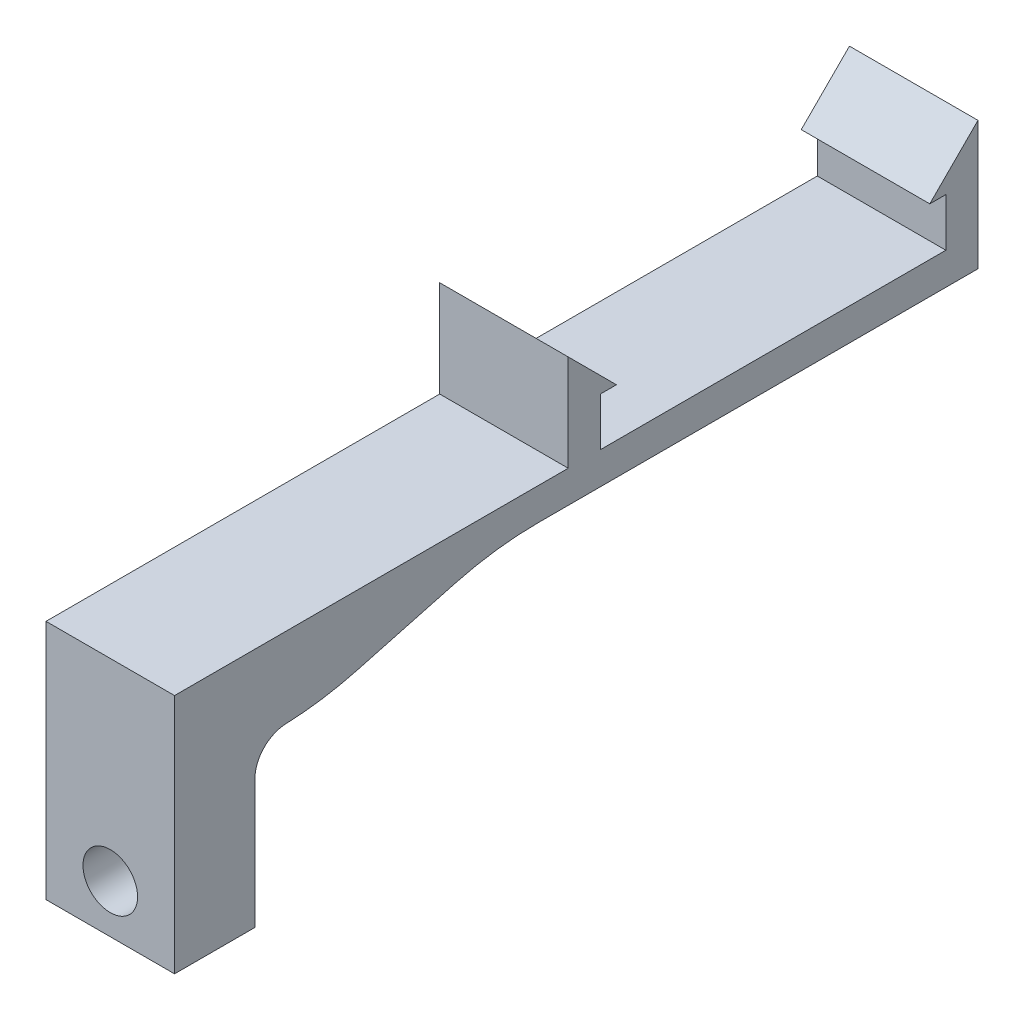
ISO-10303-21;
HEADER;
FILE_DESCRIPTION(('STEP AP214'),'2;1');
FILE_NAME('part.step','',(''),(''),'','','');
FILE_SCHEMA(('AUTOMOTIVE_DESIGN { 1 0 10303 214 1 1 1 1 }'));
ENDSEC;
DATA;
#1=APPLICATION_CONTEXT('core data for automotive mechanical design processes');
#2=APPLICATION_PROTOCOL_DEFINITION('international standard','automotive_design',2000,#1);
#3=PRODUCT_CONTEXT('',#1,'mechanical');
#4=PRODUCT('Part','Part','',(#3));
#5=PRODUCT_RELATED_PRODUCT_CATEGORY('part','',(#4));
#6=PRODUCT_DEFINITION_FORMATION('','',#4);
#7=PRODUCT_DEFINITION_CONTEXT('part definition',#1,'design');
#8=PRODUCT_DEFINITION('design','',#6,#7);
#9=PRODUCT_DEFINITION_SHAPE('','',#8);
#10=(LENGTH_UNIT() NAMED_UNIT(*) SI_UNIT(.MILLI.,.METRE.));
#11=(NAMED_UNIT(*) PLANE_ANGLE_UNIT() SI_UNIT($,.RADIAN.));
#12=(NAMED_UNIT(*) SI_UNIT($,.STERADIAN.) SOLID_ANGLE_UNIT());
#13=UNCERTAINTY_MEASURE_WITH_UNIT(LENGTH_MEASURE(1.E-05),#10,'distance_accuracy_value','');
#14=(GEOMETRIC_REPRESENTATION_CONTEXT(3) GLOBAL_UNCERTAINTY_ASSIGNED_CONTEXT((#13)) GLOBAL_UNIT_ASSIGNED_CONTEXT((#10,
#11,#12)) REPRESENTATION_CONTEXT('',''));
#15=CARTESIAN_POINT('',(0.,0.,0.));
#16=DIRECTION('',(0.,0.,1.));
#17=DIRECTION('',(1.,0.,0.));
#18=AXIS2_PLACEMENT_3D('',#15,#16,#17);
#19=CARTESIAN_POINT('',(-4.,7.5,5.));
#20=DIRECTION('',(0.,-1.,0.));
#21=DIRECTION('',(0.,0.,-1.));
#22=AXIS2_PLACEMENT_3D('',#19,#20,#21);
#23=PLANE('',#22);
#24=DIRECTION('',(0.,0.,-1.));
#25=VECTOR('',#24,1.);
#26=CARTESIAN_POINT('',(4.,7.5,5.));
#27=LINE('',#26,#25);
#28=CARTESIAN_POINT('',(4.,7.5,-21.5));
#29=VERTEX_POINT('',#28);
#30=CARTESIAN_POINT('',(4.,7.5,-43.));
#31=VERTEX_POINT('',#30);
#32=EDGE_CURVE('E224',#29,#31,#27,.T.);
#33=ORIENTED_EDGE('',*,*,#32,.T.);
#34=DIRECTION('',(-1.,0.,0.));
#35=VECTOR('',#34,1.);
#36=CARTESIAN_POINT('',(10.7082039324994,7.5,-43.));
#37=LINE('',#36,#35);
#38=CARTESIAN_POINT('',(-4.,7.5,-43.));
#39=VERTEX_POINT('',#38);
#40=EDGE_CURVE('E278',#31,#39,#37,.T.);
#41=ORIENTED_EDGE('',*,*,#40,.T.);
#42=DIRECTION('',(0.,0.,-1.));
#43=VECTOR('',#42,1.);
#44=CARTESIAN_POINT('',(-4.,7.5,5.));
#45=LINE('',#44,#43);
#46=CARTESIAN_POINT('',(-4.,7.5,-21.5));
#47=VERTEX_POINT('',#46);
#48=EDGE_CURVE('E220',#47,#39,#45,.T.);
#49=ORIENTED_EDGE('',*,*,#48,.F.);
#50=DIRECTION('',(-1.,0.,0.));
#51=VECTOR('',#50,1.);
#52=CARTESIAN_POINT('',(10.7082039324994,7.5,-21.5));
#53=LINE('',#52,#51);
#54=EDGE_CURVE('E293',#29,#47,#53,.T.);
#55=ORIENTED_EDGE('',*,*,#54,.F.);
#56=EDGE_LOOP('',(#33,#41,#49,#55));
#57=FACE_BOUND('',#56,.T.);
#58=ADVANCED_FACE('F39',(#57),#23,.F.);
#59=CARTESIAN_POINT('',(0.,0.,0.));
#60=DIRECTION('',(0.,0.,1.));
#61=DIRECTION('',(1.,0.,0.));
#62=AXIS2_PLACEMENT_3D('',#59,#60,#61);
#63=PLANE('',#62);
#64=CARTESIAN_POINT('',(0.,-4.5,0.));
#65=DIRECTION('',(0.,0.,1.));
#66=DIRECTION('',(1.,0.,0.));
#67=AXIS2_PLACEMENT_3D('',#64,#65,#66);
#68=CIRCLE('',#67,1.69999999999999);
#69=CARTESIAN_POINT('',(1.69999999999999,-4.5,0.));
#70=VERTEX_POINT('',#69);
#71=EDGE_CURVE('E257',#70,#70,#68,.T.);
#72=ORIENTED_EDGE('',*,*,#71,.T.);
#73=EDGE_LOOP('',(#72));
#74=FACE_BOUND('',#73,.T.);
#75=DIRECTION('',(0.,-1.,0.));
#76=VECTOR('',#75,1.);
#77=CARTESIAN_POINT('',(-4.,7.5,0.));
#78=LINE('',#77,#76);
#79=CARTESIAN_POINT('',(-4.,0.515632294236922,0.));
#80=VERTEX_POINT('',#79);
#81=CARTESIAN_POINT('',(-4.,-7.5,0.));
#82=VERTEX_POINT('',#81);
#83=EDGE_CURVE('E212',#80,#82,#78,.T.);
#84=ORIENTED_EDGE('',*,*,#83,.F.);
#85=DIRECTION('',(-1.,0.,0.));
#86=VECTOR('',#85,1.);
#87=CARTESIAN_POINT('',(0.,0.515632294236922,0.));
#88=LINE('',#87,#86);
#89=CARTESIAN_POINT('',(4.,0.515632294236922,0.));
#90=VERTEX_POINT('',#89);
#91=EDGE_CURVE('E60',#80,#90,#88,.F.);
#92=ORIENTED_EDGE('',*,*,#91,.T.);
#93=DIRECTION('',(0.,1.,0.));
#94=VECTOR('',#93,1.);
#95=CARTESIAN_POINT('',(4.,7.5,0.));
#96=LINE('',#95,#94);
#97=CARTESIAN_POINT('',(4.,-7.5,0.));
#98=VERTEX_POINT('',#97);
#99=EDGE_CURVE('E192',#98,#90,#96,.T.);
#100=ORIENTED_EDGE('',*,*,#99,.F.);
#101=DIRECTION('',(1.,0.,0.));
#102=VECTOR('',#101,1.);
#103=CARTESIAN_POINT('',(-4.,-7.5,0.));
#104=LINE('',#103,#102);
#105=EDGE_CURVE('E204',#82,#98,#104,.T.);
#106=ORIENTED_EDGE('',*,*,#105,.F.);
#107=EDGE_LOOP('',(#84,#92,#100,#106));
#108=FACE_BOUND('',#107,.T.);
#109=ADVANCED_FACE('F347',(#74,#108),#63,.F.);
#110=CARTESIAN_POINT('',(4.,7.5,5.));
#111=DIRECTION('',(-1.,0.,0.));
#112=DIRECTION('',(0.,-1.,0.));
#113=AXIS2_PLACEMENT_3D('',#110,#111,#112);
#114=PLANE('',#113);
#115=ORIENTED_EDGE('',*,*,#99,.T.);
#116=CARTESIAN_POINT('',(4.,0.515632294236922,-2.));
#117=DIRECTION('',(-1.,0.,0.));
#118=DIRECTION('',(0.,-1.,0.));
#119=AXIS2_PLACEMENT_3D('',#116,#117,#118);
#120=CIRCLE('',#119,2.);
#121=CARTESIAN_POINT('',(4.,2.51421117657902,-1.92461796595866));
#122=VERTEX_POINT('',#121);
#123=EDGE_CURVE('E11',#90,#122,#120,.T.);
#124=ORIENTED_EDGE('',*,*,#123,.T.);
#125=CARTESIAN_POINT('',(4.,22.5,-1.1707976255452));
#126=DIRECTION('',(-1.,0.,0.));
#127=DIRECTION('',(0.,-1.,0.));
#128=AXIS2_PLACEMENT_3D('',#125,#126,#127);
#129=CIRCLE('',#128,20.);
#130=CARTESIAN_POINT('',(4.,3.1814834742186,-6.34717852759549));
#131=VERTEX_POINT('',#130);
#132=EDGE_CURVE('E234',#122,#131,#129,.F.);
#133=ORIENTED_EDGE('',*,*,#132,.T.);
#134=DIRECTION('',(0.,0.258819045102514,-0.96592582628907));
#135=VECTOR('',#134,1.);
#136=CARTESIAN_POINT('',(4.,5.5,-15.));
#137=LINE('',#136,#135);
#138=CARTESIAN_POINT('',(4.,4.8185165257814,-12.4566690496976));
#139=VERTEX_POINT('',#138);
#140=EDGE_CURVE('E175',#131,#139,#137,.T.);
#141=ORIENTED_EDGE('',*,*,#140,.T.);
#142=CARTESIAN_POINT('',(4.,-14.5,-17.6330499517478));
#143=DIRECTION('',(-1.,0.,0.));
#144=DIRECTION('',(0.,-1.,0.));
#145=AXIS2_PLACEMENT_3D('',#142,#143,#144);
#146=CIRCLE('',#145,20.);
#147=CARTESIAN_POINT('',(4.,5.5,-17.6330499517478));
#148=VERTEX_POINT('',#147);
#149=EDGE_CURVE('E170',#139,#148,#146,.T.);
#150=ORIENTED_EDGE('',*,*,#149,.T.);
#151=DIRECTION('',(0.,0.,-1.));
#152=VECTOR('',#151,1.);
#153=CARTESIAN_POINT('',(4.,5.5,-45.));
#154=LINE('',#153,#152);
#155=CARTESIAN_POINT('',(4.,5.5,-45.));
#156=VERTEX_POINT('',#155);
#157=EDGE_CURVE('E162',#148,#156,#154,.T.);
#158=ORIENTED_EDGE('',*,*,#157,.T.);
#159=DIRECTION('',(0.,-1.,0.));
#160=VECTOR('',#159,1.);
#161=CARTESIAN_POINT('',(4.,7.5,-45.));
#162=LINE('',#161,#160);
#163=CARTESIAN_POINT('',(4.,13.5,-45.));
#164=VERTEX_POINT('',#163);
#165=EDGE_CURVE('E166',#164,#156,#162,.T.);
#166=ORIENTED_EDGE('',*,*,#165,.F.);
#167=DIRECTION('',(0.,-0.707106781186551,0.707106781186544));
#168=VECTOR('',#167,1.);
#169=CARTESIAN_POINT('',(4.,13.5,-45.));
#170=LINE('',#169,#168);
#171=CARTESIAN_POINT('',(4.,10.5,-42.));
#172=VERTEX_POINT('',#171);
#173=EDGE_CURVE('E194',#164,#172,#170,.T.);
#174=ORIENTED_EDGE('',*,*,#173,.T.);
#175=DIRECTION('',(0.,0.,-1.));
#176=VECTOR('',#175,1.);
#177=CARTESIAN_POINT('',(4.,10.5,-42.));
#178=LINE('',#177,#176);
#179=CARTESIAN_POINT('',(4.,10.5,-43.));
#180=VERTEX_POINT('',#179);
#181=EDGE_CURVE('E265',#172,#180,#178,.T.);
#182=ORIENTED_EDGE('',*,*,#181,.T.);
#183=DIRECTION('',(0.,-1.,0.));
#184=VECTOR('',#183,1.);
#185=CARTESIAN_POINT('',(4.,10.5,-43.));
#186=LINE('',#185,#184);
#187=EDGE_CURVE('E190',#180,#31,#186,.T.);
#188=ORIENTED_EDGE('',*,*,#187,.T.);
#189=ORIENTED_EDGE('',*,*,#32,.F.);
#190=DIRECTION('',(0.,1.,0.));
#191=VECTOR('',#190,1.);
#192=CARTESIAN_POINT('',(4.,7.5,-21.5));
#193=LINE('',#192,#191);
#194=CARTESIAN_POINT('',(4.,10.5,-21.5));
#195=VERTEX_POINT('',#194);
#196=EDGE_CURVE('E197',#29,#195,#193,.T.);
#197=ORIENTED_EDGE('',*,*,#196,.T.);
#198=DIRECTION('',(0.,0.,-1.));
#199=VECTOR('',#198,1.);
#200=CARTESIAN_POINT('',(4.,10.5,-21.5));
#201=LINE('',#200,#199);
#202=CARTESIAN_POINT('',(4.,10.5,-22.5));
#203=VERTEX_POINT('',#202);
#204=EDGE_CURVE('E183',#195,#203,#201,.T.);
#205=ORIENTED_EDGE('',*,*,#204,.T.);
#206=DIRECTION('',(0.,0.707106781186551,0.707106781186544));
#207=VECTOR('',#206,1.);
#208=CARTESIAN_POINT('',(4.,10.5,-22.5));
#209=LINE('',#208,#207);
#210=CARTESIAN_POINT('',(4.,13.5,-19.5));
#211=VERTEX_POINT('',#210);
#212=EDGE_CURVE('E287',#203,#211,#209,.T.);
#213=ORIENTED_EDGE('',*,*,#212,.T.);
#214=DIRECTION('',(0.,-1.,0.));
#215=VECTOR('',#214,1.);
#216=CARTESIAN_POINT('',(4.,13.5,-19.5));
#217=LINE('',#216,#215);
#218=CARTESIAN_POINT('',(4.,7.5,-19.5));
#219=VERTEX_POINT('',#218);
#220=EDGE_CURVE('E310',#211,#219,#217,.T.);
#221=ORIENTED_EDGE('',*,*,#220,.T.);
#222=CARTESIAN_POINT('',(4.,7.5,5.));
#223=VERTEX_POINT('',#222);
#224=EDGE_CURVE('E225',#223,#219,#27,.T.);
#225=ORIENTED_EDGE('',*,*,#224,.F.);
#226=DIRECTION('',(0.,1.,0.));
#227=VECTOR('',#226,1.);
#228=CARTESIAN_POINT('',(4.,7.5,5.));
#229=LINE('',#228,#227);
#230=CARTESIAN_POINT('',(4.,-7.5,5.));
#231=VERTEX_POINT('',#230);
#232=EDGE_CURVE('E200',#231,#223,#229,.T.);
#233=ORIENTED_EDGE('',*,*,#232,.F.);
#234=DIRECTION('',(0.,0.,-1.));
#235=VECTOR('',#234,1.);
#236=CARTESIAN_POINT('',(4.,-7.5,5.));
#237=LINE('',#236,#235);
#238=EDGE_CURVE('E210',#231,#98,#237,.T.);
#239=ORIENTED_EDGE('',*,*,#238,.T.);
#240=EDGE_LOOP('',(#115,#124,#133,#141,#150,#158,#166,#174,#182,#188,#189,#197,#205,#213,#221,
#225,#233,#239));
#241=FACE_BOUND('',#240,.T.);
#242=ADVANCED_FACE('F164',(#241),#114,.F.);
#243=ORIENTED_EDGE('',*,*,#224,.T.);
#244=DIRECTION('',(-1.,0.,0.));
#245=VECTOR('',#244,1.);
#246=CARTESIAN_POINT('',(10.7082039324994,7.5,-19.5));
#247=LINE('',#246,#245);
#248=CARTESIAN_POINT('',(-4.,7.5,-19.5));
#249=VERTEX_POINT('',#248);
#250=EDGE_CURVE('E296',#219,#249,#247,.T.);
#251=ORIENTED_EDGE('',*,*,#250,.T.);
#252=CARTESIAN_POINT('',(-4.,7.5,5.));
#253=VERTEX_POINT('',#252);
#254=EDGE_CURVE('E221',#253,#249,#45,.T.);
#255=ORIENTED_EDGE('',*,*,#254,.F.);
#256=DIRECTION('',(-1.,0.,0.));
#257=VECTOR('',#256,1.);
#258=CARTESIAN_POINT('',(-4.,7.5,5.));
#259=LINE('',#258,#257);
#260=EDGE_CURVE('E203',#223,#253,#259,.T.);
#261=ORIENTED_EDGE('',*,*,#260,.F.);
#262=EDGE_LOOP('',(#243,#251,#255,#261));
#263=FACE_BOUND('',#262,.T.);
#264=ADVANCED_FACE('F337',(#263),#23,.F.);
#265=CARTESIAN_POINT('',(-4.,7.5,5.));
#266=DIRECTION('',(1.,0.,0.));
#267=DIRECTION('',(0.,1.,0.));
#268=AXIS2_PLACEMENT_3D('',#265,#266,#267);
#269=PLANE('',#268);
#270=DIRECTION('',(0.,0.258819045102514,-0.96592582628907));
#271=VECTOR('',#270,1.);
#272=CARTESIAN_POINT('',(-4.,5.5,-15.));
#273=LINE('',#272,#271);
#274=CARTESIAN_POINT('',(-4.,3.1814834742186,-6.34717852759549));
#275=VERTEX_POINT('',#274);
#276=CARTESIAN_POINT('',(-4.,4.8185165257814,-12.4566690496976));
#277=VERTEX_POINT('',#276);
#278=EDGE_CURVE('E254',#275,#277,#273,.T.);
#279=ORIENTED_EDGE('',*,*,#278,.F.);
#280=CARTESIAN_POINT('',(-4.,22.5,-1.17079762554521));
#281=DIRECTION('',(1.,0.,0.));
#282=DIRECTION('',(0.,1.,0.));
#283=AXIS2_PLACEMENT_3D('',#280,#281,#282);
#284=CIRCLE('',#283,20.);
#285=CARTESIAN_POINT('',(-4.,2.51421117657902,-1.92461796595866));
#286=VERTEX_POINT('',#285);
#287=EDGE_CURVE('E232',#275,#286,#284,.F.);
#288=ORIENTED_EDGE('',*,*,#287,.T.);
#289=CARTESIAN_POINT('',(-4.,0.515632294236922,-2.));
#290=DIRECTION('',(1.,0.,0.));
#291=DIRECTION('',(0.,1.,0.));
#292=AXIS2_PLACEMENT_3D('',#289,#290,#291);
#293=CIRCLE('',#292,2.);
#294=EDGE_CURVE('E47',#286,#80,#293,.T.);
#295=ORIENTED_EDGE('',*,*,#294,.T.);
#296=ORIENTED_EDGE('',*,*,#83,.T.);
#297=DIRECTION('',(0.,0.,-1.));
#298=VECTOR('',#297,1.);
#299=CARTESIAN_POINT('',(-4.,-7.5,5.));
#300=LINE('',#299,#298);
#301=CARTESIAN_POINT('',(-4.,-7.5,5.));
#302=VERTEX_POINT('',#301);
#303=EDGE_CURVE('E217',#302,#82,#300,.T.);
#304=ORIENTED_EDGE('',*,*,#303,.F.);
#305=DIRECTION('',(0.,-1.,0.));
#306=VECTOR('',#305,1.);
#307=CARTESIAN_POINT('',(-4.,7.5,5.));
#308=LINE('',#307,#306);
#309=EDGE_CURVE('E206',#253,#302,#308,.T.);
#310=ORIENTED_EDGE('',*,*,#309,.F.);
#311=ORIENTED_EDGE('',*,*,#254,.T.);
#312=DIRECTION('',(0.,1.,0.));
#313=VECTOR('',#312,1.);
#314=CARTESIAN_POINT('',(-4.,13.5,-19.5));
#315=LINE('',#314,#313);
#316=CARTESIAN_POINT('',(-4.,13.5,-19.5));
#317=VERTEX_POINT('',#316);
#318=EDGE_CURVE('E290',#249,#317,#315,.T.);
#319=ORIENTED_EDGE('',*,*,#318,.T.);
#320=DIRECTION('',(0.,-0.707106781186551,-0.707106781186544));
#321=VECTOR('',#320,1.);
#322=CARTESIAN_POINT('',(-4.,10.5,-22.5));
#323=LINE('',#322,#321);
#324=CARTESIAN_POINT('',(-4.,10.5,-22.5));
#325=VERTEX_POINT('',#324);
#326=EDGE_CURVE('E272',#317,#325,#323,.T.);
#327=ORIENTED_EDGE('',*,*,#326,.T.);
#328=DIRECTION('',(0.,0.,1.));
#329=VECTOR('',#328,1.);
#330=CARTESIAN_POINT('',(-4.,10.5,-21.5));
#331=LINE('',#330,#329);
#332=CARTESIAN_POINT('',(-4.,10.5,-21.5));
#333=VERTEX_POINT('',#332);
#334=EDGE_CURVE('E305',#325,#333,#331,.T.);
#335=ORIENTED_EDGE('',*,*,#334,.T.);
#336=DIRECTION('',(0.,-1.,0.));
#337=VECTOR('',#336,1.);
#338=CARTESIAN_POINT('',(-4.,7.5,-21.5));
#339=LINE('',#338,#337);
#340=EDGE_CURVE('E302',#333,#47,#339,.T.);
#341=ORIENTED_EDGE('',*,*,#340,.T.);
#342=ORIENTED_EDGE('',*,*,#48,.T.);
#343=DIRECTION('',(0.,1.,0.));
#344=VECTOR('',#343,1.);
#345=CARTESIAN_POINT('',(-4.,10.5,-43.));
#346=LINE('',#345,#344);
#347=CARTESIAN_POINT('',(-4.,10.5,-43.));
#348=VERTEX_POINT('',#347);
#349=EDGE_CURVE('E268',#39,#348,#346,.T.);
#350=ORIENTED_EDGE('',*,*,#349,.T.);
#351=DIRECTION('',(0.,0.,1.));
#352=VECTOR('',#351,1.);
#353=CARTESIAN_POINT('',(-4.,10.5,-42.));
#354=LINE('',#353,#352);
#355=CARTESIAN_POINT('',(-4.,10.5,-42.));
#356=VERTEX_POINT('',#355);
#357=EDGE_CURVE('E271',#348,#356,#354,.T.);
#358=ORIENTED_EDGE('',*,*,#357,.T.);
#359=DIRECTION('',(0.,0.707106781186551,-0.707106781186544));
#360=VECTOR('',#359,1.);
#361=CARTESIAN_POINT('',(-4.,13.5,-45.));
#362=LINE('',#361,#360);
#363=CARTESIAN_POINT('',(-4.,13.5,-45.));
#364=VERTEX_POINT('',#363);
#365=EDGE_CURVE('E275',#356,#364,#362,.T.);
#366=ORIENTED_EDGE('',*,*,#365,.T.);
#367=DIRECTION('',(0.,1.,0.));
#368=VECTOR('',#367,1.);
#369=CARTESIAN_POINT('',(-4.,7.5,-45.));
#370=LINE('',#369,#368);
#371=CARTESIAN_POINT('',(-4.,5.5,-45.));
#372=VERTEX_POINT('',#371);
#373=EDGE_CURVE('E189',#372,#364,#370,.T.);
#374=ORIENTED_EDGE('',*,*,#373,.F.);
#375=DIRECTION('',(0.,0.,-1.));
#376=VECTOR('',#375,1.);
#377=CARTESIAN_POINT('',(-4.,5.5,-45.));
#378=LINE('',#377,#376);
#379=CARTESIAN_POINT('',(-4.,5.5,-17.6330499517478));
#380=VERTEX_POINT('',#379);
#381=EDGE_CURVE('E180',#380,#372,#378,.T.);
#382=ORIENTED_EDGE('',*,*,#381,.F.);
#383=CARTESIAN_POINT('',(-4.,-14.5,-17.6330499517478));
#384=DIRECTION('',(1.,0.,0.));
#385=DIRECTION('',(0.,1.,0.));
#386=AXIS2_PLACEMENT_3D('',#383,#384,#385);
#387=CIRCLE('',#386,20.);
#388=EDGE_CURVE('E238',#380,#277,#387,.T.);
#389=ORIENTED_EDGE('',*,*,#388,.T.);
#390=EDGE_LOOP('',(#279,#288,#295,#296,#304,#310,#311,#319,#327,#335,#341,#342,#350,#358,#366,
#374,#382,#389));
#391=FACE_BOUND('',#390,.T.);
#392=ADVANCED_FACE('F252',(#391),#269,.F.);
#393=CARTESIAN_POINT('',(-4.,-7.5,5.));
#394=DIRECTION('',(0.,1.,0.));
#395=DIRECTION('',(0.,0.,1.));
#396=AXIS2_PLACEMENT_3D('',#393,#394,#395);
#397=PLANE('',#396);
#398=ORIENTED_EDGE('',*,*,#105,.T.);
#399=ORIENTED_EDGE('',*,*,#238,.F.);
#400=DIRECTION('',(1.,0.,0.));
#401=VECTOR('',#400,1.);
#402=CARTESIAN_POINT('',(-4.,-7.5,5.));
#403=LINE('',#402,#401);
#404=EDGE_CURVE('E208',#302,#231,#403,.T.);
#405=ORIENTED_EDGE('',*,*,#404,.F.);
#406=ORIENTED_EDGE('',*,*,#303,.T.);
#407=EDGE_LOOP('',(#398,#399,#405,#406));
#408=FACE_BOUND('',#407,.T.);
#409=ADVANCED_FACE('F348',(#408),#397,.F.);
#410=CARTESIAN_POINT('',(0.,0.,5.));
#411=DIRECTION('',(0.,0.,1.));
#412=DIRECTION('',(1.,0.,0.));
#413=AXIS2_PLACEMENT_3D('',#410,#411,#412);
#414=PLANE('',#413);
#415=CARTESIAN_POINT('',(0.,-4.5,5.));
#416=DIRECTION('',(0.,0.,1.));
#417=DIRECTION('',(1.,0.,0.));
#418=AXIS2_PLACEMENT_3D('',#415,#416,#417);
#419=CIRCLE('',#418,1.69999999999999);
#420=CARTESIAN_POINT('',(1.69999999999999,-4.5,5.));
#421=VERTEX_POINT('',#420);
#422=EDGE_CURVE('E261',#421,#421,#419,.T.);
#423=ORIENTED_EDGE('',*,*,#422,.F.);
#424=EDGE_LOOP('',(#423));
#425=FACE_BOUND('',#424,.T.);
#426=ORIENTED_EDGE('',*,*,#232,.T.);
#427=ORIENTED_EDGE('',*,*,#260,.T.);
#428=ORIENTED_EDGE('',*,*,#309,.T.);
#429=ORIENTED_EDGE('',*,*,#404,.T.);
#430=EDGE_LOOP('',(#426,#427,#428,#429));
#431=FACE_BOUND('',#430,.T.);
#432=ADVANCED_FACE('F342',(#425,#431),#414,.T.);
#433=CARTESIAN_POINT('',(0.,0.,-45.));
#434=DIRECTION('',(0.,0.,-1.));
#435=DIRECTION('',(-1.,0.,0.));
#436=AXIS2_PLACEMENT_3D('',#433,#434,#435);
#437=PLANE('',#436);
#438=DIRECTION('',(-1.,0.,0.));
#439=VECTOR('',#438,1.);
#440=CARTESIAN_POINT('',(4.,5.5,-45.));
#441=LINE('',#440,#439);
#442=EDGE_CURVE('E174',#156,#372,#441,.T.);
#443=ORIENTED_EDGE('',*,*,#442,.T.);
#444=ORIENTED_EDGE('',*,*,#373,.T.);
#445=DIRECTION('',(-1.,0.,0.));
#446=VECTOR('',#445,1.);
#447=CARTESIAN_POINT('',(10.7082039324994,13.5,-45.));
#448=LINE('',#447,#446);
#449=EDGE_CURVE('E188',#164,#364,#448,.T.);
#450=ORIENTED_EDGE('',*,*,#449,.F.);
#451=ORIENTED_EDGE('',*,*,#165,.T.);
#452=EDGE_LOOP('',(#443,#444,#450,#451));
#453=FACE_BOUND('',#452,.T.);
#454=ADVANCED_FACE('F186',(#453),#437,.T.);
#455=CARTESIAN_POINT('',(10.7082039324994,10.5,-22.5));
#456=DIRECTION('',(0.,0.707106781186544,-0.707106781186551));
#457=DIRECTION('',(0.,0.707106781186551,0.707106781186544));
#458=AXIS2_PLACEMENT_3D('',#455,#456,#457);
#459=PLANE('',#458);
#460=ORIENTED_EDGE('',*,*,#212,.F.);
#461=DIRECTION('',(-1.,0.,0.));
#462=VECTOR('',#461,1.);
#463=CARTESIAN_POINT('',(10.7082039324994,10.5,-22.5));
#464=LINE('',#463,#462);
#465=EDGE_CURVE('E288',#203,#325,#464,.T.);
#466=ORIENTED_EDGE('',*,*,#465,.T.);
#467=ORIENTED_EDGE('',*,*,#326,.F.);
#468=DIRECTION('',(-1.,0.,0.));
#469=VECTOR('',#468,1.);
#470=CARTESIAN_POINT('',(10.7082039324994,13.5,-19.5));
#471=LINE('',#470,#469);
#472=EDGE_CURVE('E298',#211,#317,#471,.T.);
#473=ORIENTED_EDGE('',*,*,#472,.F.);
#474=EDGE_LOOP('',(#460,#466,#467,#473));
#475=FACE_BOUND('',#474,.T.);
#476=ADVANCED_FACE('F330',(#475),#459,.T.);
#477=CARTESIAN_POINT('',(10.7082039324994,13.5,-19.5));
#478=DIRECTION('',(0.,0.,1.));
#479=DIRECTION('',(1.,0.,0.));
#480=AXIS2_PLACEMENT_3D('',#477,#478,#479);
#481=PLANE('',#480);
#482=ORIENTED_EDGE('',*,*,#220,.F.);
#483=ORIENTED_EDGE('',*,*,#472,.T.);
#484=ORIENTED_EDGE('',*,*,#318,.F.);
#485=ORIENTED_EDGE('',*,*,#250,.F.);
#486=EDGE_LOOP('',(#482,#483,#484,#485));
#487=FACE_BOUND('',#486,.T.);
#488=ADVANCED_FACE('F333',(#487),#481,.T.);
#489=CARTESIAN_POINT('',(10.7082039324994,7.5,-21.5));
#490=DIRECTION('',(0.,0.,-1.));
#491=DIRECTION('',(-1.,0.,0.));
#492=AXIS2_PLACEMENT_3D('',#489,#490,#491);
#493=PLANE('',#492);
#494=ORIENTED_EDGE('',*,*,#196,.F.);
#495=ORIENTED_EDGE('',*,*,#54,.T.);
#496=ORIENTED_EDGE('',*,*,#340,.F.);
#497=DIRECTION('',(-1.,0.,0.));
#498=VECTOR('',#497,1.);
#499=CARTESIAN_POINT('',(10.7082039324994,10.5,-21.5));
#500=LINE('',#499,#498);
#501=EDGE_CURVE('E291',#195,#333,#500,.T.);
#502=ORIENTED_EDGE('',*,*,#501,.F.);
#503=EDGE_LOOP('',(#494,#495,#496,#502));
#504=FACE_BOUND('',#503,.T.);
#505=ADVANCED_FACE('F323',(#504),#493,.T.);
#506=CARTESIAN_POINT('',(10.7082039324994,10.5,-21.5));
#507=DIRECTION('',(0.,-1.,0.));
#508=DIRECTION('',(1.,0.,0.));
#509=AXIS2_PLACEMENT_3D('',#506,#507,#508);
#510=PLANE('',#509);
#511=ORIENTED_EDGE('',*,*,#204,.F.);
#512=ORIENTED_EDGE('',*,*,#501,.T.);
#513=ORIENTED_EDGE('',*,*,#334,.F.);
#514=ORIENTED_EDGE('',*,*,#465,.F.);
#515=EDGE_LOOP('',(#511,#512,#513,#514));
#516=FACE_BOUND('',#515,.T.);
#517=ADVANCED_FACE('F327',(#516),#510,.T.);
#518=CARTESIAN_POINT('',(10.7082039324994,13.5,-45.));
#519=DIRECTION('',(0.,0.707106781186544,0.707106781186551));
#520=DIRECTION('',(0.,-0.707106781186551,0.707106781186544));
#521=AXIS2_PLACEMENT_3D('',#518,#519,#520);
#522=PLANE('',#521);
#523=ORIENTED_EDGE('',*,*,#173,.F.);
#524=ORIENTED_EDGE('',*,*,#449,.T.);
#525=ORIENTED_EDGE('',*,*,#365,.F.);
#526=DIRECTION('',(-1.,0.,0.));
#527=VECTOR('',#526,1.);
#528=CARTESIAN_POINT('',(10.7082039324994,10.5,-42.));
#529=LINE('',#528,#527);
#530=EDGE_CURVE('E280',#172,#356,#529,.T.);
#531=ORIENTED_EDGE('',*,*,#530,.F.);
#532=EDGE_LOOP('',(#523,#524,#525,#531));
#533=FACE_BOUND('',#532,.T.);
#534=ADVANCED_FACE('F387',(#533),#522,.T.);
#535=CARTESIAN_POINT('',(10.7082039324994,10.5,-42.));
#536=DIRECTION('',(0.,-1.,0.));
#537=DIRECTION('',(1.,0.,0.));
#538=AXIS2_PLACEMENT_3D('',#535,#536,#537);
#539=PLANE('',#538);
#540=ORIENTED_EDGE('',*,*,#181,.F.);
#541=ORIENTED_EDGE('',*,*,#530,.T.);
#542=ORIENTED_EDGE('',*,*,#357,.F.);
#543=DIRECTION('',(-1.,0.,0.));
#544=VECTOR('',#543,1.);
#545=CARTESIAN_POINT('',(10.7082039324994,10.5,-43.));
#546=LINE('',#545,#544);
#547=EDGE_CURVE('E282',#180,#348,#546,.T.);
#548=ORIENTED_EDGE('',*,*,#547,.F.);
#549=EDGE_LOOP('',(#540,#541,#542,#548));
#550=FACE_BOUND('',#549,.T.);
#551=ADVANCED_FACE('F392',(#550),#539,.T.);
#552=CARTESIAN_POINT('',(10.7082039324994,10.5,-43.));
#553=DIRECTION('',(0.,0.,1.));
#554=DIRECTION('',(1.,0.,0.));
#555=AXIS2_PLACEMENT_3D('',#552,#553,#554);
#556=PLANE('',#555);
#557=ORIENTED_EDGE('',*,*,#187,.F.);
#558=ORIENTED_EDGE('',*,*,#547,.T.);
#559=ORIENTED_EDGE('',*,*,#349,.F.);
#560=ORIENTED_EDGE('',*,*,#40,.F.);
#561=EDGE_LOOP('',(#557,#558,#559,#560));
#562=FACE_BOUND('',#561,.T.);
#563=ADVANCED_FACE('F397',(#562),#556,.T.);
#564=CARTESIAN_POINT('',(4.,5.5,-45.));
#565=DIRECTION('',(0.,1.,0.));
#566=DIRECTION('',(-1.,0.,0.));
#567=AXIS2_PLACEMENT_3D('',#564,#565,#566);
#568=PLANE('',#567);
#569=ORIENTED_EDGE('',*,*,#157,.F.);
#570=DIRECTION('',(-1.,0.,0.));
#571=VECTOR('',#570,1.);
#572=CARTESIAN_POINT('',(-4.,5.5,-17.6330499517478));
#573=LINE('',#572,#571);
#574=EDGE_CURVE('E236',#148,#380,#573,.T.);
#575=ORIENTED_EDGE('',*,*,#574,.T.);
#576=ORIENTED_EDGE('',*,*,#381,.T.);
#577=ORIENTED_EDGE('',*,*,#442,.F.);
#578=EDGE_LOOP('',(#569,#575,#576,#577));
#579=FACE_BOUND('',#578,.T.);
#580=ADVANCED_FACE('F178',(#579),#568,.F.);
#581=CARTESIAN_POINT('',(4.,5.5,-15.));
#582=DIRECTION('',(0.,0.96592582628907,0.258819045102514));
#583=DIRECTION('',(0.,-0.258819045102514,0.96592582628907));
#584=AXIS2_PLACEMENT_3D('',#581,#582,#583);
#585=PLANE('',#584);
#586=ORIENTED_EDGE('',*,*,#140,.F.);
#587=DIRECTION('',(-1.,0.,0.));
#588=VECTOR('',#587,1.);
#589=CARTESIAN_POINT('',(4.,3.1814834742186,-6.34717852759549));
#590=LINE('',#589,#588);
#591=EDGE_CURVE('E229',#131,#275,#590,.T.);
#592=ORIENTED_EDGE('',*,*,#591,.T.);
#593=ORIENTED_EDGE('',*,*,#278,.T.);
#594=DIRECTION('',(-1.,0.,0.));
#595=VECTOR('',#594,1.);
#596=CARTESIAN_POINT('',(4.,4.8185165257814,-12.4566690496976));
#597=LINE('',#596,#595);
#598=EDGE_CURVE('E227',#277,#139,#597,.F.);
#599=ORIENTED_EDGE('',*,*,#598,.T.);
#600=EDGE_LOOP('',(#586,#592,#593,#599));
#601=FACE_BOUND('',#600,.T.);
#602=ADVANCED_FACE('F378',(#601),#585,.F.);
#603=CARTESIAN_POINT('',(3.99999999999999,22.5,-1.1707976255452));
#604=DIRECTION('',(-1.,0.,0.));
#605=DIRECTION('',(0.,0.,1.));
#606=AXIS2_PLACEMENT_3D('',#603,#604,#605);
#607=CYLINDRICAL_SURFACE('',#606,20.);
#608=ORIENTED_EDGE('',*,*,#132,.F.);
#609=DIRECTION('',(-1.,0.,0.));
#610=VECTOR('',#609,1.);
#611=CARTESIAN_POINT('',(3.99999999999999,2.51421117657902,-1.92461796595866));
#612=LINE('',#611,#610);
#613=EDGE_CURVE('E241',#122,#286,#612,.T.);
#614=ORIENTED_EDGE('',*,*,#613,.T.);
#615=ORIENTED_EDGE('',*,*,#287,.F.);
#616=ORIENTED_EDGE('',*,*,#591,.F.);
#617=EDGE_LOOP('',(#608,#614,#615,#616));
#618=FACE_BOUND('',#617,.T.);
#619=ADVANCED_FACE('F247',(#618),#607,.T.);
#620=CARTESIAN_POINT('',(4.,-14.5,-17.6330499517478));
#621=DIRECTION('',(1.,0.,0.));
#622=DIRECTION('',(0.,1.,0.));
#623=AXIS2_PLACEMENT_3D('',#620,#621,#622);
#624=CYLINDRICAL_SURFACE('',#623,20.);
#625=ORIENTED_EDGE('',*,*,#149,.F.);
#626=ORIENTED_EDGE('',*,*,#598,.F.);
#627=ORIENTED_EDGE('',*,*,#388,.F.);
#628=ORIENTED_EDGE('',*,*,#574,.F.);
#629=EDGE_LOOP('',(#625,#626,#627,#628));
#630=FACE_BOUND('',#629,.T.);
#631=ADVANCED_FACE('F377',(#630),#624,.F.);
#632=CARTESIAN_POINT('',(3.99999999999999,0.515632294236922,-2.));
#633=DIRECTION('',(-1.,0.,0.));
#634=DIRECTION('',(0.,0.,1.));
#635=AXIS2_PLACEMENT_3D('',#632,#633,#634);
#636=CYLINDRICAL_SURFACE('',#635,2.);
#637=ORIENTED_EDGE('',*,*,#123,.F.);
#638=ORIENTED_EDGE('',*,*,#91,.F.);
#639=ORIENTED_EDGE('',*,*,#294,.F.);
#640=ORIENTED_EDGE('',*,*,#613,.F.);
#641=EDGE_LOOP('',(#637,#638,#639,#640));
#642=FACE_BOUND('',#641,.T.);
#643=ADVANCED_FACE('F41',(#642),#636,.F.);
#644=CARTESIAN_POINT('',(0.,-4.5,5.));
#645=DIRECTION('',(0.,0.,1.));
#646=DIRECTION('',(1.,0.,0.));
#647=AXIS2_PLACEMENT_3D('',#644,#645,#646);
#648=CYLINDRICAL_SURFACE('',#647,1.69999999999999);
#649=ORIENTED_EDGE('',*,*,#422,.T.);
#650=EDGE_LOOP('',(#649));
#651=FACE_BOUND('',#650,.T.);
#652=ORIENTED_EDGE('',*,*,#71,.F.);
#653=EDGE_LOOP('',(#652));
#654=FACE_BOUND('',#653,.T.);
#655=ADVANCED_FACE('F384',(#651,#654),#648,.F.);
#656=CLOSED_SHELL('',(#58,#109,#242,#264,#392,#409,#432,#454,#476,#488,#505,#517,#534,#551,#563,
#580,#602,#619,#631,#643,#655));
#657=MANIFOLD_SOLID_BREP('B2',#656);
#658=ADVANCED_BREP_SHAPE_REPRESENTATION('',(#18,#657),#14);
#659=SHAPE_DEFINITION_REPRESENTATION(#9,#658);
ENDSEC;
END-ISO-10303-21;
